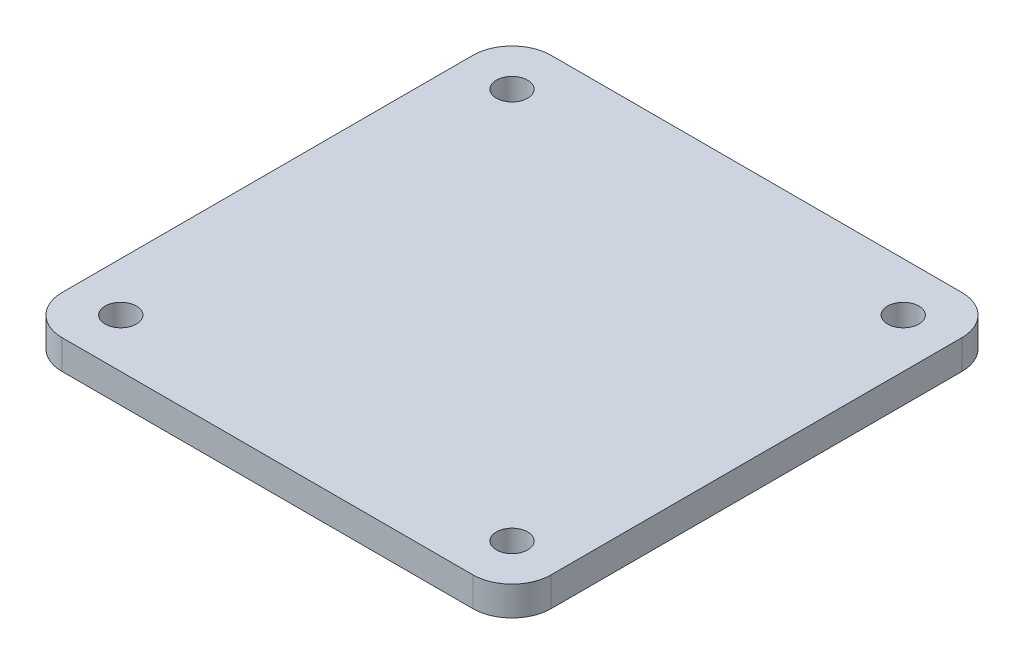
ISO-10303-21;
HEADER;
FILE_DESCRIPTION(('STEP AP214'),'2;1');
FILE_NAME('part.step','',(''),(''),'','','');
FILE_SCHEMA(('AUTOMOTIVE_DESIGN { 1 0 10303 214 1 1 1 1 }'));
ENDSEC;
DATA;
#1=APPLICATION_CONTEXT('core data for automotive mechanical design processes');
#2=APPLICATION_PROTOCOL_DEFINITION('international standard','automotive_design',2000,#1);
#3=PRODUCT_CONTEXT('',#1,'mechanical');
#4=PRODUCT('Part','Part','',(#3));
#5=PRODUCT_RELATED_PRODUCT_CATEGORY('part','',(#4));
#6=PRODUCT_DEFINITION_FORMATION('','',#4);
#7=PRODUCT_DEFINITION_CONTEXT('part definition',#1,'design');
#8=PRODUCT_DEFINITION('design','',#6,#7);
#9=PRODUCT_DEFINITION_SHAPE('','',#8);
#10=(LENGTH_UNIT() NAMED_UNIT(*) SI_UNIT(.MILLI.,.METRE.));
#11=(NAMED_UNIT(*) PLANE_ANGLE_UNIT() SI_UNIT($,.RADIAN.));
#12=(NAMED_UNIT(*) SI_UNIT($,.STERADIAN.) SOLID_ANGLE_UNIT());
#13=UNCERTAINTY_MEASURE_WITH_UNIT(LENGTH_MEASURE(1.E-05),#10,'distance_accuracy_value','');
#14=(GEOMETRIC_REPRESENTATION_CONTEXT(3) GLOBAL_UNCERTAINTY_ASSIGNED_CONTEXT((#13)) GLOBAL_UNIT_ASSIGNED_CONTEXT((#10,
#11,#12)) REPRESENTATION_CONTEXT('',''));
#15=CARTESIAN_POINT('',(0.,0.,0.));
#16=DIRECTION('',(0.,0.,1.));
#17=DIRECTION('',(1.,0.,0.));
#18=AXIS2_PLACEMENT_3D('',#15,#16,#17);
#19=CARTESIAN_POINT('',(25.,3.,25.));
#20=DIRECTION('',(-1.,0.,0.));
#21=DIRECTION('',(0.,0.,1.));
#22=AXIS2_PLACEMENT_3D('',#19,#20,#21);
#23=PLANE('',#22);
#24=DIRECTION('',(0.,0.,-1.));
#25=VECTOR('',#24,1.);
#26=CARTESIAN_POINT('',(25.,3.,25.));
#27=LINE('',#26,#25);
#28=CARTESIAN_POINT('',(25.,3.,21.));
#29=VERTEX_POINT('',#28);
#30=CARTESIAN_POINT('',(25.,3.,-21.));
#31=VERTEX_POINT('',#30);
#32=EDGE_CURVE('E117',#29,#31,#27,.T.);
#33=ORIENTED_EDGE('',*,*,#32,.F.);
#34=DIRECTION('',(0.,-1.,0.));
#35=VECTOR('',#34,1.);
#36=CARTESIAN_POINT('',(25.,3.,21.));
#37=LINE('',#36,#35);
#38=CARTESIAN_POINT('',(25.,0.,21.));
#39=VERTEX_POINT('',#38);
#40=EDGE_CURVE('E102',#29,#39,#37,.T.);
#41=ORIENTED_EDGE('',*,*,#40,.T.);
#42=DIRECTION('',(0.,0.,-1.));
#43=VECTOR('',#42,1.);
#44=CARTESIAN_POINT('',(25.,0.,25.));
#45=LINE('',#44,#43);
#46=CARTESIAN_POINT('',(25.,0.,-21.));
#47=VERTEX_POINT('',#46);
#48=EDGE_CURVE('E114',#39,#47,#45,.T.);
#49=ORIENTED_EDGE('',*,*,#48,.T.);
#50=DIRECTION('',(0.,-1.,0.));
#51=VECTOR('',#50,1.);
#52=CARTESIAN_POINT('',(25.,3.,-21.));
#53=LINE('',#52,#51);
#54=EDGE_CURVE('E119',#47,#31,#53,.F.);
#55=ORIENTED_EDGE('',*,*,#54,.T.);
#56=EDGE_LOOP('',(#33,#41,#49,#55));
#57=FACE_BOUND('',#56,.T.);
#58=ADVANCED_FACE('F33',(#57),#23,.F.);
#59=CARTESIAN_POINT('',(-25.,3.,-25.));
#60=DIRECTION('',(0.,0.,1.));
#61=DIRECTION('',(1.,0.,0.));
#62=AXIS2_PLACEMENT_3D('',#59,#60,#61);
#63=PLANE('',#62);
#64=DIRECTION('',(-1.,0.,0.));
#65=VECTOR('',#64,1.);
#66=CARTESIAN_POINT('',(-25.,3.,-25.));
#67=LINE('',#66,#65);
#68=CARTESIAN_POINT('',(21.,3.,-25.));
#69=VERTEX_POINT('',#68);
#70=CARTESIAN_POINT('',(-21.,3.,-25.));
#71=VERTEX_POINT('',#70);
#72=EDGE_CURVE('E172',#69,#71,#67,.T.);
#73=ORIENTED_EDGE('',*,*,#72,.F.);
#74=DIRECTION('',(0.,-1.,0.));
#75=VECTOR('',#74,1.);
#76=CARTESIAN_POINT('',(21.,3.,-25.));
#77=LINE('',#76,#75);
#78=CARTESIAN_POINT('',(21.,0.,-25.));
#79=VERTEX_POINT('',#78);
#80=EDGE_CURVE('E156',#69,#79,#77,.T.);
#81=ORIENTED_EDGE('',*,*,#80,.T.);
#82=DIRECTION('',(-1.,0.,0.));
#83=VECTOR('',#82,1.);
#84=CARTESIAN_POINT('',(-25.,0.,-25.));
#85=LINE('',#84,#83);
#86=CARTESIAN_POINT('',(-21.,0.,-25.));
#87=VERTEX_POINT('',#86);
#88=EDGE_CURVE('E123',#79,#87,#85,.T.);
#89=ORIENTED_EDGE('',*,*,#88,.T.);
#90=DIRECTION('',(0.,-1.,0.));
#91=VECTOR('',#90,1.);
#92=CARTESIAN_POINT('',(-21.,3.,-25.));
#93=LINE('',#92,#91);
#94=EDGE_CURVE('E154',#87,#71,#93,.F.);
#95=ORIENTED_EDGE('',*,*,#94,.T.);
#96=EDGE_LOOP('',(#73,#81,#89,#95));
#97=FACE_BOUND('',#96,.T.);
#98=ADVANCED_FACE('F221',(#97),#63,.F.);
#99=CARTESIAN_POINT('',(-25.,3.,25.));
#100=DIRECTION('',(1.,0.,0.));
#101=DIRECTION('',(0.,0.,-1.));
#102=AXIS2_PLACEMENT_3D('',#99,#100,#101);
#103=PLANE('',#102);
#104=DIRECTION('',(0.,0.,1.));
#105=VECTOR('',#104,1.);
#106=CARTESIAN_POINT('',(-25.,0.,25.));
#107=LINE('',#106,#105);
#108=CARTESIAN_POINT('',(-25.,0.,-21.));
#109=VERTEX_POINT('',#108);
#110=CARTESIAN_POINT('',(-25.,0.,21.));
#111=VERTEX_POINT('',#110);
#112=EDGE_CURVE('E127',#109,#111,#107,.T.);
#113=ORIENTED_EDGE('',*,*,#112,.T.);
#114=DIRECTION('',(0.,-1.,0.));
#115=VECTOR('',#114,1.);
#116=CARTESIAN_POINT('',(-25.,3.,21.));
#117=LINE('',#116,#115);
#118=CARTESIAN_POINT('',(-25.,3.,21.));
#119=VERTEX_POINT('',#118);
#120=EDGE_CURVE('E11',#111,#119,#117,.F.);
#121=ORIENTED_EDGE('',*,*,#120,.T.);
#122=DIRECTION('',(0.,0.,1.));
#123=VECTOR('',#122,1.);
#124=CARTESIAN_POINT('',(-25.,3.,25.));
#125=LINE('',#124,#123);
#126=CARTESIAN_POINT('',(-25.,3.,-21.));
#127=VERTEX_POINT('',#126);
#128=EDGE_CURVE('E162',#127,#119,#125,.T.);
#129=ORIENTED_EDGE('',*,*,#128,.F.);
#130=DIRECTION('',(0.,-1.,0.));
#131=VECTOR('',#130,1.);
#132=CARTESIAN_POINT('',(-25.,3.,-21.));
#133=LINE('',#132,#131);
#134=EDGE_CURVE('E41',#127,#109,#133,.T.);
#135=ORIENTED_EDGE('',*,*,#134,.T.);
#136=EDGE_LOOP('',(#113,#121,#129,#135));
#137=FACE_BOUND('',#136,.T.);
#138=ADVANCED_FACE('F161',(#137),#103,.F.);
#139=CARTESIAN_POINT('',(-25.,3.,25.));
#140=DIRECTION('',(0.,0.,-1.));
#141=DIRECTION('',(-1.,0.,0.));
#142=AXIS2_PLACEMENT_3D('',#139,#140,#141);
#143=PLANE('',#142);
#144=DIRECTION('',(1.,0.,0.));
#145=VECTOR('',#144,1.);
#146=CARTESIAN_POINT('',(-25.,0.,25.));
#147=LINE('',#146,#145);
#148=CARTESIAN_POINT('',(-21.,0.,25.));
#149=VERTEX_POINT('',#148);
#150=CARTESIAN_POINT('',(21.,0.,25.));
#151=VERTEX_POINT('',#150);
#152=EDGE_CURVE('E137',#149,#151,#147,.T.);
#153=ORIENTED_EDGE('',*,*,#152,.T.);
#154=DIRECTION('',(0.,-1.,0.));
#155=VECTOR('',#154,1.);
#156=CARTESIAN_POINT('',(21.,3.,25.));
#157=LINE('',#156,#155);
#158=CARTESIAN_POINT('',(21.,3.,25.));
#159=VERTEX_POINT('',#158);
#160=EDGE_CURVE('E103',#151,#159,#157,.F.);
#161=ORIENTED_EDGE('',*,*,#160,.T.);
#162=DIRECTION('',(1.,0.,0.));
#163=VECTOR('',#162,1.);
#164=CARTESIAN_POINT('',(-25.,3.,25.));
#165=LINE('',#164,#163);
#166=CARTESIAN_POINT('',(-21.,3.,25.));
#167=VERTEX_POINT('',#166);
#168=EDGE_CURVE('E133',#167,#159,#165,.T.);
#169=ORIENTED_EDGE('',*,*,#168,.F.);
#170=DIRECTION('',(0.,-1.,0.));
#171=VECTOR('',#170,1.);
#172=CARTESIAN_POINT('',(-21.,3.,25.));
#173=LINE('',#172,#171);
#174=EDGE_CURVE('E108',#167,#149,#173,.T.);
#175=ORIENTED_EDGE('',*,*,#174,.T.);
#176=EDGE_LOOP('',(#153,#161,#169,#175));
#177=FACE_BOUND('',#176,.T.);
#178=ADVANCED_FACE('F170',(#177),#143,.F.);
#179=CARTESIAN_POINT('',(0.,3.,0.));
#180=DIRECTION('',(0.,-1.,0.));
#181=DIRECTION('',(0.,0.,-1.));
#182=AXIS2_PLACEMENT_3D('',#179,#180,#181);
#183=PLANE('',#182);
#184=CARTESIAN_POINT('',(-20.,3.,20.));
#185=DIRECTION('',(0.,1.,0.));
#186=DIRECTION('',(0.,0.,1.));
#187=AXIS2_PLACEMENT_3D('',#184,#185,#186);
#188=CIRCLE('',#187,1.6);
#189=CARTESIAN_POINT('',(-20.,3.,21.6));
#190=VERTEX_POINT('',#189);
#191=EDGE_CURVE('E183',#190,#190,#188,.T.);
#192=ORIENTED_EDGE('',*,*,#191,.F.);
#193=EDGE_LOOP('',(#192));
#194=FACE_BOUND('',#193,.T.);
#195=CARTESIAN_POINT('',(20.,3.,20.));
#196=DIRECTION('',(0.,1.,0.));
#197=DIRECTION('',(0.,0.,1.));
#198=AXIS2_PLACEMENT_3D('',#195,#196,#197);
#199=CIRCLE('',#198,1.6);
#200=CARTESIAN_POINT('',(20.,3.,21.6));
#201=VERTEX_POINT('',#200);
#202=EDGE_CURVE('E182',#201,#201,#199,.T.);
#203=ORIENTED_EDGE('',*,*,#202,.F.);
#204=EDGE_LOOP('',(#203));
#205=FACE_BOUND('',#204,.T.);
#206=CARTESIAN_POINT('',(20.,3.,-20.));
#207=DIRECTION('',(0.,1.,0.));
#208=DIRECTION('',(0.,0.,1.));
#209=AXIS2_PLACEMENT_3D('',#206,#207,#208);
#210=CIRCLE('',#209,1.6);
#211=CARTESIAN_POINT('',(20.,3.,-18.4));
#212=VERTEX_POINT('',#211);
#213=EDGE_CURVE('E189',#212,#212,#210,.T.);
#214=ORIENTED_EDGE('',*,*,#213,.F.);
#215=EDGE_LOOP('',(#214));
#216=FACE_BOUND('',#215,.T.);
#217=CARTESIAN_POINT('',(-20.,3.,-20.));
#218=DIRECTION('',(0.,1.,0.));
#219=DIRECTION('',(0.,0.,1.));
#220=AXIS2_PLACEMENT_3D('',#217,#218,#219);
#221=CIRCLE('',#220,1.6);
#222=CARTESIAN_POINT('',(-20.,3.,-18.4));
#223=VERTEX_POINT('',#222);
#224=EDGE_CURVE('E130',#223,#223,#221,.T.);
#225=ORIENTED_EDGE('',*,*,#224,.F.);
#226=EDGE_LOOP('',(#225));
#227=FACE_BOUND('',#226,.T.);
#228=ORIENTED_EDGE('',*,*,#168,.T.);
#229=CARTESIAN_POINT('',(21.,3.,21.));
#230=DIRECTION('',(0.,-1.,0.));
#231=DIRECTION('',(0.,0.,-1.));
#232=AXIS2_PLACEMENT_3D('',#229,#230,#231);
#233=CIRCLE('',#232,4.);
#234=EDGE_CURVE('E152',#159,#29,#233,.F.);
#235=ORIENTED_EDGE('',*,*,#234,.T.);
#236=ORIENTED_EDGE('',*,*,#32,.T.);
#237=CARTESIAN_POINT('',(21.,3.,-21.));
#238=DIRECTION('',(0.,-1.,0.));
#239=DIRECTION('',(0.,0.,-1.));
#240=AXIS2_PLACEMENT_3D('',#237,#238,#239);
#241=CIRCLE('',#240,4.);
#242=EDGE_CURVE('E150',#31,#69,#241,.F.);
#243=ORIENTED_EDGE('',*,*,#242,.T.);
#244=ORIENTED_EDGE('',*,*,#72,.T.);
#245=CARTESIAN_POINT('',(-21.,3.,-21.));
#246=DIRECTION('',(0.,-1.,0.));
#247=DIRECTION('',(0.,0.,-1.));
#248=AXIS2_PLACEMENT_3D('',#245,#246,#247);
#249=CIRCLE('',#248,4.);
#250=EDGE_CURVE('E53',#71,#127,#249,.F.);
#251=ORIENTED_EDGE('',*,*,#250,.T.);
#252=ORIENTED_EDGE('',*,*,#128,.T.);
#253=CARTESIAN_POINT('',(-21.,3.,21.));
#254=DIRECTION('',(0.,-1.,0.));
#255=DIRECTION('',(0.,0.,-1.));
#256=AXIS2_PLACEMENT_3D('',#253,#254,#255);
#257=CIRCLE('',#256,4.);
#258=EDGE_CURVE('E148',#119,#167,#257,.F.);
#259=ORIENTED_EDGE('',*,*,#258,.T.);
#260=EDGE_LOOP('',(#228,#235,#236,#243,#244,#251,#252,#259));
#261=FACE_BOUND('',#260,.T.);
#262=ADVANCED_FACE('F200',(#194,#205,#216,#227,#261),#183,.F.);
#263=CARTESIAN_POINT('',(0.,0.,0.));
#264=DIRECTION('',(0.,-1.,0.));
#265=DIRECTION('',(0.,0.,-1.));
#266=AXIS2_PLACEMENT_3D('',#263,#264,#265);
#267=PLANE('',#266);
#268=CARTESIAN_POINT('',(-20.,0.,20.));
#269=DIRECTION('',(0.,-1.,0.));
#270=DIRECTION('',(0.,0.,-1.));
#271=AXIS2_PLACEMENT_3D('',#268,#269,#270);
#272=CIRCLE('',#271,1.6);
#273=CARTESIAN_POINT('',(-20.,0.,18.4));
#274=VERTEX_POINT('',#273);
#275=EDGE_CURVE('E179',#274,#274,#272,.F.);
#276=ORIENTED_EDGE('',*,*,#275,.T.);
#277=EDGE_LOOP('',(#276));
#278=FACE_BOUND('',#277,.T.);
#279=CARTESIAN_POINT('',(20.,0.,20.));
#280=DIRECTION('',(0.,-1.,0.));
#281=DIRECTION('',(0.,0.,-1.));
#282=AXIS2_PLACEMENT_3D('',#279,#280,#281);
#283=CIRCLE('',#282,1.6);
#284=CARTESIAN_POINT('',(20.,0.,18.4));
#285=VERTEX_POINT('',#284);
#286=EDGE_CURVE('E186',#285,#285,#283,.F.);
#287=ORIENTED_EDGE('',*,*,#286,.T.);
#288=EDGE_LOOP('',(#287));
#289=FACE_BOUND('',#288,.T.);
#290=CARTESIAN_POINT('',(20.,0.,-20.));
#291=DIRECTION('',(0.,-1.,0.));
#292=DIRECTION('',(0.,0.,-1.));
#293=AXIS2_PLACEMENT_3D('',#290,#291,#292);
#294=CIRCLE('',#293,1.6);
#295=CARTESIAN_POINT('',(20.,0.,-21.6));
#296=VERTEX_POINT('',#295);
#297=EDGE_CURVE('E178',#296,#296,#294,.F.);
#298=ORIENTED_EDGE('',*,*,#297,.T.);
#299=EDGE_LOOP('',(#298));
#300=FACE_BOUND('',#299,.T.);
#301=CARTESIAN_POINT('',(-20.,0.,-20.));
#302=DIRECTION('',(0.,-1.,0.));
#303=DIRECTION('',(0.,0.,-1.));
#304=AXIS2_PLACEMENT_3D('',#301,#302,#303);
#305=CIRCLE('',#304,1.6);
#306=CARTESIAN_POINT('',(-20.,0.,-21.6));
#307=VERTEX_POINT('',#306);
#308=EDGE_CURVE('E124',#307,#307,#305,.F.);
#309=ORIENTED_EDGE('',*,*,#308,.T.);
#310=EDGE_LOOP('',(#309));
#311=FACE_BOUND('',#310,.T.);
#312=ORIENTED_EDGE('',*,*,#48,.F.);
#313=CARTESIAN_POINT('',(21.,0.,21.));
#314=DIRECTION('',(0.,-1.,0.));
#315=DIRECTION('',(0.,0.,-1.));
#316=AXIS2_PLACEMENT_3D('',#313,#314,#315);
#317=CIRCLE('',#316,4.);
#318=EDGE_CURVE('E98',#39,#151,#317,.T.);
#319=ORIENTED_EDGE('',*,*,#318,.T.);
#320=ORIENTED_EDGE('',*,*,#152,.F.);
#321=CARTESIAN_POINT('',(-21.,0.,21.));
#322=DIRECTION('',(0.,-1.,0.));
#323=DIRECTION('',(0.,0.,-1.));
#324=AXIS2_PLACEMENT_3D('',#321,#322,#323);
#325=CIRCLE('',#324,4.);
#326=EDGE_CURVE('E141',#149,#111,#325,.T.);
#327=ORIENTED_EDGE('',*,*,#326,.T.);
#328=ORIENTED_EDGE('',*,*,#112,.F.);
#329=CARTESIAN_POINT('',(-21.,0.,-21.));
#330=DIRECTION('',(0.,-1.,0.));
#331=DIRECTION('',(0.,0.,-1.));
#332=AXIS2_PLACEMENT_3D('',#329,#330,#331);
#333=CIRCLE('',#332,4.);
#334=EDGE_CURVE('E118',#109,#87,#333,.T.);
#335=ORIENTED_EDGE('',*,*,#334,.T.);
#336=ORIENTED_EDGE('',*,*,#88,.F.);
#337=CARTESIAN_POINT('',(21.,0.,-21.));
#338=DIRECTION('',(0.,-1.,0.));
#339=DIRECTION('',(0.,0.,-1.));
#340=AXIS2_PLACEMENT_3D('',#337,#338,#339);
#341=CIRCLE('',#340,4.);
#342=EDGE_CURVE('E109',#79,#47,#341,.T.);
#343=ORIENTED_EDGE('',*,*,#342,.T.);
#344=EDGE_LOOP('',(#312,#319,#320,#327,#328,#335,#336,#343));
#345=FACE_BOUND('',#344,.T.);
#346=ADVANCED_FACE('F121',(#278,#289,#300,#311,#345),#267,.T.);
#347=CARTESIAN_POINT('',(-20.,-4.52548339959391,-20.));
#348=DIRECTION('',(0.,1.,0.));
#349=DIRECTION('',(0.,0.,1.));
#350=AXIS2_PLACEMENT_3D('',#347,#348,#349);
#351=CYLINDRICAL_SURFACE('',#350,1.6);
#352=ORIENTED_EDGE('',*,*,#224,.T.);
#353=EDGE_LOOP('',(#352));
#354=FACE_BOUND('',#353,.T.);
#355=ORIENTED_EDGE('',*,*,#308,.F.);
#356=EDGE_LOOP('',(#355));
#357=FACE_BOUND('',#356,.T.);
#358=ADVANCED_FACE('F207',(#354,#357),#351,.F.);
#359=CARTESIAN_POINT('',(20.,-4.52548339959391,-20.));
#360=DIRECTION('',(0.,1.,0.));
#361=DIRECTION('',(0.,0.,1.));
#362=AXIS2_PLACEMENT_3D('',#359,#360,#361);
#363=CYLINDRICAL_SURFACE('',#362,1.6);
#364=ORIENTED_EDGE('',*,*,#213,.T.);
#365=EDGE_LOOP('',(#364));
#366=FACE_BOUND('',#365,.T.);
#367=ORIENTED_EDGE('',*,*,#297,.F.);
#368=EDGE_LOOP('',(#367));
#369=FACE_BOUND('',#368,.T.);
#370=ADVANCED_FACE('F197',(#366,#369),#363,.F.);
#371=CARTESIAN_POINT('',(20.,-4.52548339959391,20.));
#372=DIRECTION('',(0.,1.,0.));
#373=DIRECTION('',(0.,0.,1.));
#374=AXIS2_PLACEMENT_3D('',#371,#372,#373);
#375=CYLINDRICAL_SURFACE('',#374,1.6);
#376=ORIENTED_EDGE('',*,*,#202,.T.);
#377=EDGE_LOOP('',(#376));
#378=FACE_BOUND('',#377,.T.);
#379=ORIENTED_EDGE('',*,*,#286,.F.);
#380=EDGE_LOOP('',(#379));
#381=FACE_BOUND('',#380,.T.);
#382=ADVANCED_FACE('F306',(#378,#381),#375,.F.);
#383=CARTESIAN_POINT('',(-20.,-4.52548339959391,20.));
#384=DIRECTION('',(0.,1.,0.));
#385=DIRECTION('',(0.,0.,1.));
#386=AXIS2_PLACEMENT_3D('',#383,#384,#385);
#387=CYLINDRICAL_SURFACE('',#386,1.6);
#388=ORIENTED_EDGE('',*,*,#191,.T.);
#389=EDGE_LOOP('',(#388));
#390=FACE_BOUND('',#389,.T.);
#391=ORIENTED_EDGE('',*,*,#275,.F.);
#392=EDGE_LOOP('',(#391));
#393=FACE_BOUND('',#392,.T.);
#394=ADVANCED_FACE('F233',(#390,#393),#387,.F.);
#395=CARTESIAN_POINT('',(21.,3.,21.));
#396=DIRECTION('',(0.,-1.,0.));
#397=DIRECTION('',(0.,0.,-1.));
#398=AXIS2_PLACEMENT_3D('',#395,#396,#397);
#399=CYLINDRICAL_SURFACE('',#398,4.);
#400=ORIENTED_EDGE('',*,*,#234,.F.);
#401=ORIENTED_EDGE('',*,*,#160,.F.);
#402=ORIENTED_EDGE('',*,*,#318,.F.);
#403=ORIENTED_EDGE('',*,*,#40,.F.);
#404=EDGE_LOOP('',(#400,#401,#402,#403));
#405=FACE_BOUND('',#404,.T.);
#406=ADVANCED_FACE('F101',(#405),#399,.T.);
#407=CARTESIAN_POINT('',(21.,3.,-21.));
#408=DIRECTION('',(0.,-1.,0.));
#409=DIRECTION('',(0.,0.,-1.));
#410=AXIS2_PLACEMENT_3D('',#407,#408,#409);
#411=CYLINDRICAL_SURFACE('',#410,4.);
#412=ORIENTED_EDGE('',*,*,#242,.F.);
#413=ORIENTED_EDGE('',*,*,#54,.F.);
#414=ORIENTED_EDGE('',*,*,#342,.F.);
#415=ORIENTED_EDGE('',*,*,#80,.F.);
#416=EDGE_LOOP('',(#412,#413,#414,#415));
#417=FACE_BOUND('',#416,.T.);
#418=ADVANCED_FACE('F232',(#417),#411,.T.);
#419=CARTESIAN_POINT('',(-21.,3.,21.));
#420=DIRECTION('',(0.,-1.,0.));
#421=DIRECTION('',(0.,0.,-1.));
#422=AXIS2_PLACEMENT_3D('',#419,#420,#421);
#423=CYLINDRICAL_SURFACE('',#422,4.);
#424=ORIENTED_EDGE('',*,*,#258,.F.);
#425=ORIENTED_EDGE('',*,*,#120,.F.);
#426=ORIENTED_EDGE('',*,*,#326,.F.);
#427=ORIENTED_EDGE('',*,*,#174,.F.);
#428=EDGE_LOOP('',(#424,#425,#426,#427));
#429=FACE_BOUND('',#428,.T.);
#430=ADVANCED_FACE('F167',(#429),#423,.T.);
#431=CARTESIAN_POINT('',(-21.,3.,-21.));
#432=DIRECTION('',(0.,-1.,0.));
#433=DIRECTION('',(0.,0.,-1.));
#434=AXIS2_PLACEMENT_3D('',#431,#432,#433);
#435=CYLINDRICAL_SURFACE('',#434,4.);
#436=ORIENTED_EDGE('',*,*,#250,.F.);
#437=ORIENTED_EDGE('',*,*,#94,.F.);
#438=ORIENTED_EDGE('',*,*,#334,.F.);
#439=ORIENTED_EDGE('',*,*,#134,.F.);
#440=EDGE_LOOP('',(#436,#437,#438,#439));
#441=FACE_BOUND('',#440,.T.);
#442=ADVANCED_FACE('F35',(#441),#435,.T.);
#443=CLOSED_SHELL('',(#58,#98,#138,#178,#262,#346,#358,#370,#382,#394,#406,#418,#430,#442));
#444=MANIFOLD_SOLID_BREP('B2',#443);
#445=ADVANCED_BREP_SHAPE_REPRESENTATION('',(#18,#444),#14);
#446=SHAPE_DEFINITION_REPRESENTATION(#9,#445);
ENDSEC;
END-ISO-10303-21;
